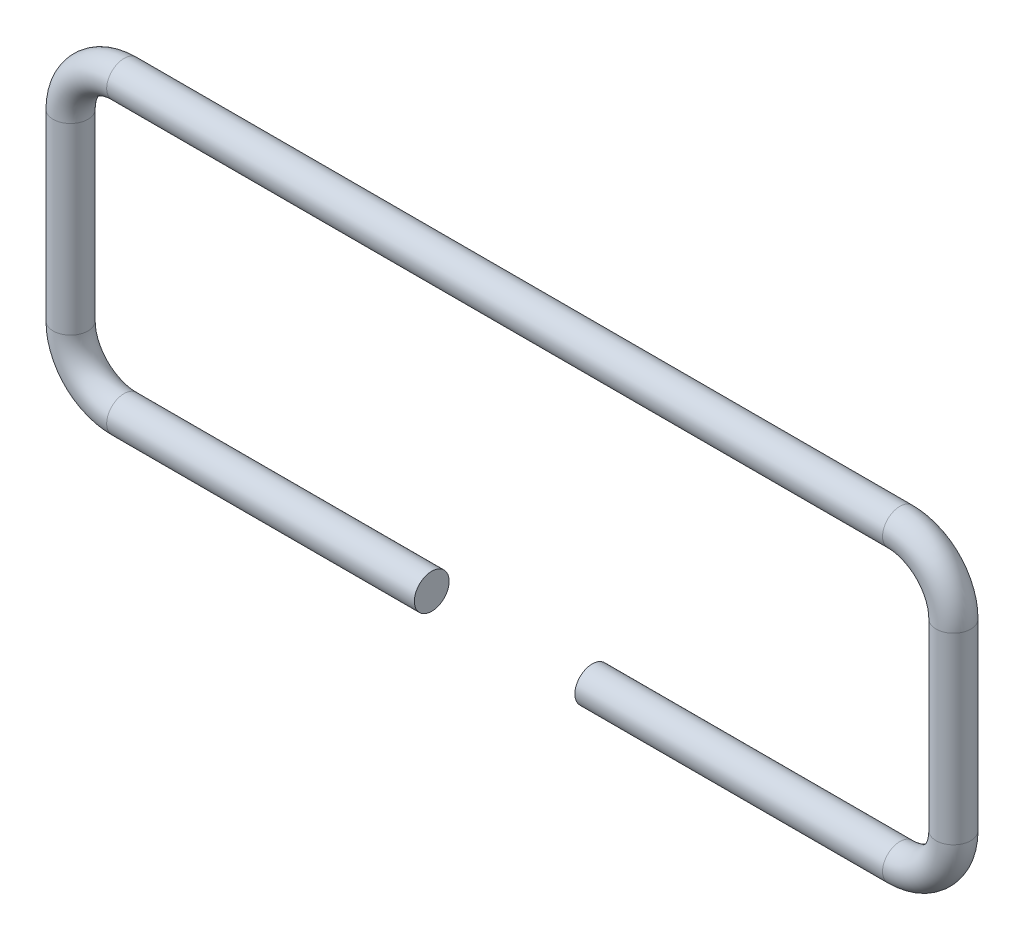
ISO-10303-21;
HEADER;
FILE_DESCRIPTION(('STEP AP214'),'2;1');
FILE_NAME('part.step','',(''),(''),'','','');
FILE_SCHEMA(('AUTOMOTIVE_DESIGN { 1 0 10303 214 1 1 1 1 }'));
ENDSEC;
DATA;
#1=APPLICATION_CONTEXT('core data for automotive mechanical design processes');
#2=APPLICATION_PROTOCOL_DEFINITION('international standard','automotive_design',2000,#1);
#3=PRODUCT_CONTEXT('',#1,'mechanical');
#4=PRODUCT('Part','Part','',(#3));
#5=PRODUCT_RELATED_PRODUCT_CATEGORY('part','',(#4));
#6=PRODUCT_DEFINITION_FORMATION('','',#4);
#7=PRODUCT_DEFINITION_CONTEXT('part definition',#1,'design');
#8=PRODUCT_DEFINITION('design','',#6,#7);
#9=PRODUCT_DEFINITION_SHAPE('','',#8);
#10=(LENGTH_UNIT() NAMED_UNIT(*) SI_UNIT(.MILLI.,.METRE.));
#11=(NAMED_UNIT(*) PLANE_ANGLE_UNIT() SI_UNIT($,.RADIAN.));
#12=(NAMED_UNIT(*) SI_UNIT($,.STERADIAN.) SOLID_ANGLE_UNIT());
#13=UNCERTAINTY_MEASURE_WITH_UNIT(LENGTH_MEASURE(1.E-05),#10,'distance_accuracy_value','');
#14=(GEOMETRIC_REPRESENTATION_CONTEXT(3) GLOBAL_UNCERTAINTY_ASSIGNED_CONTEXT((#13)) GLOBAL_UNIT_ASSIGNED_CONTEXT((#10,
#11,#12)) REPRESENTATION_CONTEXT('',''));
#15=CARTESIAN_POINT('',(0.,0.,0.));
#16=DIRECTION('',(0.,0.,1.));
#17=DIRECTION('',(1.,0.,0.));
#18=AXIS2_PLACEMENT_3D('',#15,#16,#17);
#19=CARTESIAN_POINT('',(3.,-5.425,0.));
#20=DIRECTION('',(1.,0.,0.));
#21=DIRECTION('',(0.,0.,-1.));
#22=AXIS2_PLACEMENT_3D('',#19,#20,#21);
#23=PLANE('',#22);
#24=CARTESIAN_POINT('',(3.,-5.425,0.));
#25=DIRECTION('',(1.,0.,0.));
#26=DIRECTION('',(0.,0.,-1.));
#27=AXIS2_PLACEMENT_3D('',#24,#25,#26);
#28=CIRCLE('',#27,0.65);
#29=CARTESIAN_POINT('',(3.,-5.425,-0.65));
#30=VERTEX_POINT('',#29);
#31=EDGE_CURVE('E45',#30,#30,#28,.T.);
#32=ORIENTED_EDGE('',*,*,#31,.F.);
#33=EDGE_LOOP('',(#32));
#34=FACE_BOUND('',#33,.T.);
#35=ADVANCED_FACE('F33',(#34),#23,.F.);
#36=CARTESIAN_POINT('',(-3.,-5.425,0.));
#37=DIRECTION('',(1.,0.,0.));
#38=DIRECTION('',(0.,0.,-1.));
#39=AXIS2_PLACEMENT_3D('',#36,#37,#38);
#40=PLANE('',#39);
#41=CARTESIAN_POINT('',(-3.,-5.425,0.));
#42=DIRECTION('',(1.,0.,0.));
#43=DIRECTION('',(0.,0.,-1.));
#44=AXIS2_PLACEMENT_3D('',#41,#42,#43);
#45=CIRCLE('',#44,0.65);
#46=CARTESIAN_POINT('',(-3.,-5.425,-0.65));
#47=VERTEX_POINT('',#46);
#48=EDGE_CURVE('E11',#47,#47,#45,.T.);
#49=ORIENTED_EDGE('',*,*,#48,.T.);
#50=EDGE_LOOP('',(#49));
#51=FACE_BOUND('',#50,.T.);
#52=ADVANCED_FACE('F48',(#51),#40,.T.);
#53=CARTESIAN_POINT('',(3.,-5.425,0.));
#54=DIRECTION('',(1.,0.,0.));
#55=DIRECTION('',(0.,0.,-1.));
#56=AXIS2_PLACEMENT_3D('',#53,#54,#55);
#57=CYLINDRICAL_SURFACE('',#56,0.65);
#58=CARTESIAN_POINT('',(14.5,-5.425,0.));
#59=DIRECTION('',(1.,0.,0.));
#60=DIRECTION('',(0.,0.,-1.));
#61=AXIS2_PLACEMENT_3D('',#58,#59,#60);
#62=CIRCLE('',#61,0.65);
#63=CARTESIAN_POINT('',(14.5,-6.075,0.));
#64=VERTEX_POINT('',#63);
#65=EDGE_CURVE('E77',#64,#64,#62,.T.);
#66=ORIENTED_EDGE('',*,*,#65,.F.);
#67=EDGE_LOOP('',(#66));
#68=FACE_BOUND('',#67,.T.);
#69=ORIENTED_EDGE('',*,*,#31,.T.);
#70=EDGE_LOOP('',(#69));
#71=FACE_BOUND('',#70,.T.);
#72=ADVANCED_FACE('F81',(#68,#71),#57,.T.);
#73=CARTESIAN_POINT('',(14.5,-3.425,0.));
#74=DIRECTION('',(0.,0.,1.));
#75=DIRECTION('',(1.,0.,0.));
#76=AXIS2_PLACEMENT_3D('',#73,#74,#75);
#77=TOROIDAL_SURFACE('',#76,2.,0.65);
#78=CARTESIAN_POINT('',(16.5,-3.425,0.));
#79=DIRECTION('',(0.,1.,0.));
#80=DIRECTION('',(0.,0.,-1.));
#81=AXIS2_PLACEMENT_3D('',#78,#79,#80);
#82=CIRCLE('',#81,0.65);
#83=CARTESIAN_POINT('',(17.15,-3.425,0.));
#84=VERTEX_POINT('',#83);
#85=EDGE_CURVE('E74',#84,#84,#82,.T.);
#86=CARTESIAN_POINT('',(14.5,-3.425,0.));
#87=DIRECTION('',(0.,0.,1.));
#88=DIRECTION('',(1.,0.,0.));
#89=AXIS2_PLACEMENT_3D('',#86,#87,#88);
#90=CIRCLE('',#89,2.65);
#91=EDGE_CURVE('',#64,#84,#90,.T.);
#92=ORIENTED_EDGE('',*,*,#65,.T.);
#93=ORIENTED_EDGE('',*,*,#85,.F.);
#94=ORIENTED_EDGE('',*,*,#91,.T.);
#95=ORIENTED_EDGE('',*,*,#91,.F.);
#96=EDGE_LOOP('',(#92,#94,#93,#95));
#97=FACE_BOUND('',#96,.T.);
#98=ADVANCED_FACE('F83',(#97),#77,.T.);
#99=CARTESIAN_POINT('',(16.5,-3.425,0.));
#100=DIRECTION('',(0.,1.,0.));
#101=DIRECTION('',(0.,0.,1.));
#102=AXIS2_PLACEMENT_3D('',#99,#100,#101);
#103=CYLINDRICAL_SURFACE('',#102,0.65);
#104=CARTESIAN_POINT('',(16.5,3.425,0.));
#105=DIRECTION('',(0.,1.,0.));
#106=DIRECTION('',(0.,0.,-1.));
#107=AXIS2_PLACEMENT_3D('',#104,#105,#106);
#108=CIRCLE('',#107,0.65);
#109=CARTESIAN_POINT('',(17.15,3.425,0.));
#110=VERTEX_POINT('',#109);
#111=EDGE_CURVE('E71',#110,#110,#108,.T.);
#112=ORIENTED_EDGE('',*,*,#111,.F.);
#113=EDGE_LOOP('',(#112));
#114=FACE_BOUND('',#113,.T.);
#115=ORIENTED_EDGE('',*,*,#85,.T.);
#116=EDGE_LOOP('',(#115));
#117=FACE_BOUND('',#116,.T.);
#118=ADVANCED_FACE('F90',(#114,#117),#103,.T.);
#119=CARTESIAN_POINT('',(14.5,3.425,0.));
#120=DIRECTION('',(0.,0.,1.));
#121=DIRECTION('',(1.,0.,0.));
#122=AXIS2_PLACEMENT_3D('',#119,#120,#121);
#123=TOROIDAL_SURFACE('',#122,2.,0.65);
#124=CARTESIAN_POINT('',(14.5,5.425,0.));
#125=DIRECTION('',(-1.,0.,0.));
#126=DIRECTION('',(0.,0.,-1.));
#127=AXIS2_PLACEMENT_3D('',#124,#125,#126);
#128=CIRCLE('',#127,0.65);
#129=CARTESIAN_POINT('',(14.5,6.075,0.));
#130=VERTEX_POINT('',#129);
#131=EDGE_CURVE('E68',#130,#130,#128,.T.);
#132=CARTESIAN_POINT('',(14.5,3.425,0.));
#133=DIRECTION('',(0.,0.,1.));
#134=DIRECTION('',(1.,0.,0.));
#135=AXIS2_PLACEMENT_3D('',#132,#133,#134);
#136=CIRCLE('',#135,2.65);
#137=EDGE_CURVE('',#110,#130,#136,.T.);
#138=ORIENTED_EDGE('',*,*,#111,.T.);
#139=ORIENTED_EDGE('',*,*,#131,.F.);
#140=ORIENTED_EDGE('',*,*,#137,.T.);
#141=ORIENTED_EDGE('',*,*,#137,.F.);
#142=EDGE_LOOP('',(#138,#140,#139,#141));
#143=FACE_BOUND('',#142,.T.);
#144=ADVANCED_FACE('F97',(#143),#123,.T.);
#145=CARTESIAN_POINT('',(14.5,5.425,0.));
#146=DIRECTION('',(-1.,0.,0.));
#147=DIRECTION('',(0.,-1.,0.));
#148=AXIS2_PLACEMENT_3D('',#145,#146,#147);
#149=CYLINDRICAL_SURFACE('',#148,0.65);
#150=CARTESIAN_POINT('',(-14.5,5.425,0.));
#151=DIRECTION('',(-1.,0.,0.));
#152=DIRECTION('',(0.,0.,-1.));
#153=AXIS2_PLACEMENT_3D('',#150,#151,#152);
#154=CIRCLE('',#153,0.65);
#155=CARTESIAN_POINT('',(-14.5,6.075,0.));
#156=VERTEX_POINT('',#155);
#157=EDGE_CURVE('E65',#156,#156,#154,.T.);
#158=ORIENTED_EDGE('',*,*,#157,.F.);
#159=EDGE_LOOP('',(#158));
#160=FACE_BOUND('',#159,.T.);
#161=ORIENTED_EDGE('',*,*,#131,.T.);
#162=EDGE_LOOP('',(#161));
#163=FACE_BOUND('',#162,.T.);
#164=ADVANCED_FACE('F101',(#160,#163),#149,.T.);
#165=CARTESIAN_POINT('',(-14.5,3.425,0.));
#166=DIRECTION('',(0.,0.,1.));
#167=DIRECTION('',(1.,0.,0.));
#168=AXIS2_PLACEMENT_3D('',#165,#166,#167);
#169=TOROIDAL_SURFACE('',#168,2.,0.65);
#170=CARTESIAN_POINT('',(-16.5,3.425,0.));
#171=DIRECTION('',(0.,-1.,0.));
#172=DIRECTION('',(0.,0.,-1.));
#173=AXIS2_PLACEMENT_3D('',#170,#171,#172);
#174=CIRCLE('',#173,0.65);
#175=CARTESIAN_POINT('',(-17.15,3.425,0.));
#176=VERTEX_POINT('',#175);
#177=EDGE_CURVE('E60',#176,#176,#174,.T.);
#178=CARTESIAN_POINT('',(-14.5,3.425,0.));
#179=DIRECTION('',(0.,0.,1.));
#180=DIRECTION('',(1.,0.,0.));
#181=AXIS2_PLACEMENT_3D('',#178,#179,#180);
#182=CIRCLE('',#181,2.65);
#183=EDGE_CURVE('',#156,#176,#182,.T.);
#184=ORIENTED_EDGE('',*,*,#157,.T.);
#185=ORIENTED_EDGE('',*,*,#177,.F.);
#186=ORIENTED_EDGE('',*,*,#183,.T.);
#187=ORIENTED_EDGE('',*,*,#183,.F.);
#188=EDGE_LOOP('',(#184,#186,#185,#187));
#189=FACE_BOUND('',#188,.T.);
#190=ADVANCED_FACE('F105',(#189),#169,.T.);
#191=CARTESIAN_POINT('',(-16.5,3.425,0.));
#192=DIRECTION('',(0.,-1.,0.));
#193=DIRECTION('',(0.,0.,-1.));
#194=AXIS2_PLACEMENT_3D('',#191,#192,#193);
#195=CYLINDRICAL_SURFACE('',#194,0.65);
#196=CARTESIAN_POINT('',(-16.5,-3.425,0.));
#197=DIRECTION('',(0.,-1.,0.));
#198=DIRECTION('',(0.,0.,-1.));
#199=AXIS2_PLACEMENT_3D('',#196,#197,#198);
#200=CIRCLE('',#199,0.65);
#201=CARTESIAN_POINT('',(-17.15,-3.425,0.));
#202=VERTEX_POINT('',#201);
#203=EDGE_CURVE('E58',#202,#202,#200,.T.);
#204=ORIENTED_EDGE('',*,*,#203,.F.);
#205=EDGE_LOOP('',(#204));
#206=FACE_BOUND('',#205,.T.);
#207=ORIENTED_EDGE('',*,*,#177,.T.);
#208=EDGE_LOOP('',(#207));
#209=FACE_BOUND('',#208,.T.);
#210=ADVANCED_FACE('F109',(#206,#209),#195,.T.);
#211=CARTESIAN_POINT('',(-14.5,-3.425,0.));
#212=DIRECTION('',(0.,0.,1.));
#213=DIRECTION('',(1.,0.,0.));
#214=AXIS2_PLACEMENT_3D('',#211,#212,#213);
#215=TOROIDAL_SURFACE('',#214,2.,0.65);
#216=CARTESIAN_POINT('',(-14.5,-5.425,0.));
#217=DIRECTION('',(1.,0.,0.));
#218=DIRECTION('',(0.,0.,-1.));
#219=AXIS2_PLACEMENT_3D('',#216,#217,#218);
#220=CIRCLE('',#219,0.65);
#221=CARTESIAN_POINT('',(-14.5,-6.075,0.));
#222=VERTEX_POINT('',#221);
#223=EDGE_CURVE('E40',#222,#222,#220,.T.);
#224=CARTESIAN_POINT('',(-14.5,-3.425,0.));
#225=DIRECTION('',(0.,0.,1.));
#226=DIRECTION('',(1.,0.,0.));
#227=AXIS2_PLACEMENT_3D('',#224,#225,#226);
#228=CIRCLE('',#227,2.65);
#229=EDGE_CURVE('',#202,#222,#228,.T.);
#230=ORIENTED_EDGE('',*,*,#203,.T.);
#231=ORIENTED_EDGE('',*,*,#223,.F.);
#232=ORIENTED_EDGE('',*,*,#229,.T.);
#233=ORIENTED_EDGE('',*,*,#229,.F.);
#234=EDGE_LOOP('',(#230,#232,#231,#233));
#235=FACE_BOUND('',#234,.T.);
#236=ADVANCED_FACE('F53',(#235),#215,.T.);
#237=CARTESIAN_POINT('',(-14.5,-5.425,0.));
#238=DIRECTION('',(1.,0.,0.));
#239=DIRECTION('',(0.,1.,0.));
#240=AXIS2_PLACEMENT_3D('',#237,#238,#239);
#241=CYLINDRICAL_SURFACE('',#240,0.65);
#242=ORIENTED_EDGE('',*,*,#48,.F.);
#243=EDGE_LOOP('',(#242));
#244=FACE_BOUND('',#243,.T.);
#245=ORIENTED_EDGE('',*,*,#223,.T.);
#246=EDGE_LOOP('',(#245));
#247=FACE_BOUND('',#246,.T.);
#248=ADVANCED_FACE('F50',(#244,#247),#241,.T.);
#249=CLOSED_SHELL('',(#35,#52,#72,#98,#118,#144,#164,#190,#210,#236,#248));
#250=MANIFOLD_SOLID_BREP('B2',#249);
#251=ADVANCED_BREP_SHAPE_REPRESENTATION('',(#18,#250),#14);
#252=SHAPE_DEFINITION_REPRESENTATION(#9,#251);
ENDSEC;
END-ISO-10303-21;
